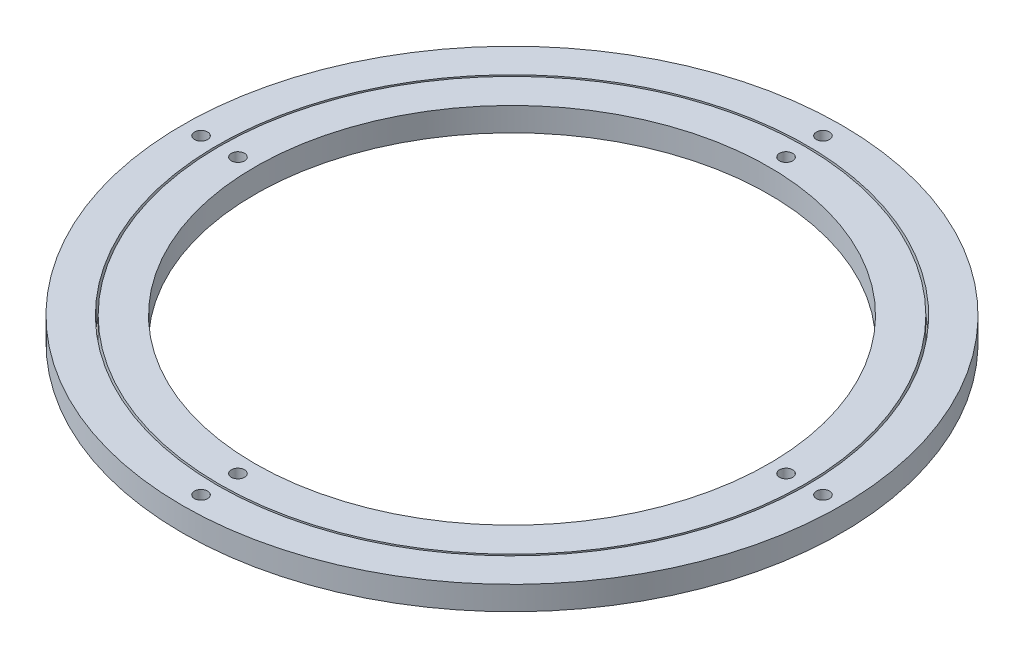
ISO-10303-21;
HEADER;
FILE_DESCRIPTION(('STEP AP214'),'2;1');
FILE_NAME('part.step','',(''),(''),'','','');
FILE_SCHEMA(('AUTOMOTIVE_DESIGN { 1 0 10303 214 1 1 1 1 }'));
ENDSEC;
DATA;
#1=APPLICATION_CONTEXT('core data for automotive mechanical design processes');
#2=APPLICATION_PROTOCOL_DEFINITION('international standard','automotive_design',2000,#1);
#3=PRODUCT_CONTEXT('',#1,'mechanical');
#4=PRODUCT('Part','Part','',(#3));
#5=PRODUCT_RELATED_PRODUCT_CATEGORY('part','',(#4));
#6=PRODUCT_DEFINITION_FORMATION('','',#4);
#7=PRODUCT_DEFINITION_CONTEXT('part definition',#1,'design');
#8=PRODUCT_DEFINITION('design','',#6,#7);
#9=PRODUCT_DEFINITION_SHAPE('','',#8);
#10=(LENGTH_UNIT() NAMED_UNIT(*) SI_UNIT(.MILLI.,.METRE.));
#11=(NAMED_UNIT(*) PLANE_ANGLE_UNIT() SI_UNIT($,.RADIAN.));
#12=(NAMED_UNIT(*) SI_UNIT($,.STERADIAN.) SOLID_ANGLE_UNIT());
#13=UNCERTAINTY_MEASURE_WITH_UNIT(LENGTH_MEASURE(1.E-05),#10,'distance_accuracy_value','');
#14=(GEOMETRIC_REPRESENTATION_CONTEXT(3) GLOBAL_UNCERTAINTY_ASSIGNED_CONTEXT((#13)) GLOBAL_UNIT_ASSIGNED_CONTEXT((#10,
#11,#12)) REPRESENTATION_CONTEXT('',''));
#15=CARTESIAN_POINT('',(0.,0.,0.));
#16=DIRECTION('',(0.,0.,1.));
#17=DIRECTION('',(1.,0.,0.));
#18=AXIS2_PLACEMENT_3D('',#15,#16,#17);
#19=CARTESIAN_POINT('',(0.,9.,0.));
#20=DIRECTION('',(0.,1.,0.));
#21=DIRECTION('',(0.,0.,1.));
#22=AXIS2_PLACEMENT_3D('',#19,#20,#21);
#23=PLANE('',#22);
#24=CARTESIAN_POINT('',(0.,9.,-103.9457));
#25=DIRECTION('',(0.,1.,0.));
#26=DIRECTION('',(0.,0.,1.));
#27=AXIS2_PLACEMENT_3D('',#24,#25,#26);
#28=CIRCLE('',#27,2.5);
#29=CARTESIAN_POINT('',(0.,9.,-101.4457));
#30=VERTEX_POINT('',#29);
#31=EDGE_CURVE('E72',#30,#30,#28,.T.);
#32=ORIENTED_EDGE('',*,*,#31,.F.);
#33=EDGE_LOOP('',(#32));
#34=FACE_BOUND('',#33,.T.);
#35=CARTESIAN_POINT('',(103.9457,9.,0.));
#36=DIRECTION('',(0.,1.,0.));
#37=DIRECTION('',(0.,0.,1.));
#38=AXIS2_PLACEMENT_3D('',#35,#36,#37);
#39=CIRCLE('',#38,2.50000000000036);
#40=CARTESIAN_POINT('',(103.9457,9.,2.50000000000034));
#41=VERTEX_POINT('',#40);
#42=EDGE_CURVE('E94',#41,#41,#39,.T.);
#43=ORIENTED_EDGE('',*,*,#42,.F.);
#44=EDGE_LOOP('',(#43));
#45=FACE_BOUND('',#44,.T.);
#46=CARTESIAN_POINT('',(0.,9.,103.9457));
#47=DIRECTION('',(0.,1.,0.));
#48=DIRECTION('',(0.,0.,1.));
#49=AXIS2_PLACEMENT_3D('',#46,#47,#48);
#50=CIRCLE('',#49,2.50000000000072);
#51=CARTESIAN_POINT('',(0.,9.,106.445700000001));
#52=VERTEX_POINT('',#51);
#53=EDGE_CURVE('E91',#52,#52,#50,.T.);
#54=ORIENTED_EDGE('',*,*,#53,.F.);
#55=EDGE_LOOP('',(#54));
#56=FACE_BOUND('',#55,.T.);
#57=CARTESIAN_POINT('',(-103.9457,9.,0.));
#58=DIRECTION('',(0.,1.,0.));
#59=DIRECTION('',(0.,0.,1.));
#60=AXIS2_PLACEMENT_3D('',#57,#58,#59);
#61=CIRCLE('',#60,2.50000000000107);
#62=CARTESIAN_POINT('',(-103.9457,9.,2.5000000000011));
#63=VERTEX_POINT('',#62);
#64=EDGE_CURVE('E88',#63,#63,#61,.T.);
#65=ORIENTED_EDGE('',*,*,#64,.F.);
#66=EDGE_LOOP('',(#65));
#67=FACE_BOUND('',#66,.T.);
#68=CARTESIAN_POINT('',(0.,9.,0.));
#69=DIRECTION('',(0.,1.,0.));
#70=DIRECTION('',(0.,0.,1.));
#71=AXIS2_PLACEMENT_3D('',#68,#69,#70);
#72=CIRCLE('',#71,111.);
#73=CARTESIAN_POINT('',(0.,9.,111.));
#74=VERTEX_POINT('',#73);
#75=EDGE_CURVE('E11',#74,#74,#72,.T.);
#76=ORIENTED_EDGE('',*,*,#75,.T.);
#77=EDGE_LOOP('',(#76));
#78=FACE_BOUND('',#77,.T.);
#79=CARTESIAN_POINT('',(0.,9.,0.));
#80=DIRECTION('',(0.,1.,0.));
#81=DIRECTION('',(0.,0.,1.));
#82=AXIS2_PLACEMENT_3D('',#79,#80,#81);
#83=CIRCLE('',#82,97.5);
#84=CARTESIAN_POINT('',(0.,9.,97.5));
#85=VERTEX_POINT('',#84);
#86=EDGE_CURVE('E62',#85,#85,#83,.T.);
#87=ORIENTED_EDGE('',*,*,#86,.F.);
#88=EDGE_LOOP('',(#87));
#89=FACE_BOUND('',#88,.T.);
#90=ADVANCED_FACE('F49',(#34,#45,#56,#67,#78,#89),#23,.T.);
#91=CARTESIAN_POINT('',(0.,0.,0.));
#92=DIRECTION('',(0.,1.,0.));
#93=DIRECTION('',(0.,0.,1.));
#94=AXIS2_PLACEMENT_3D('',#91,#92,#93);
#95=PLANE('',#94);
#96=CARTESIAN_POINT('',(0.,0.,-103.9457));
#97=DIRECTION('',(0.,1.,0.));
#98=DIRECTION('',(0.,0.,1.));
#99=AXIS2_PLACEMENT_3D('',#96,#97,#98);
#100=CIRCLE('',#99,2.5);
#101=CARTESIAN_POINT('',(0.,0.,-101.4457));
#102=VERTEX_POINT('',#101);
#103=EDGE_CURVE('E53',#102,#102,#100,.T.);
#104=ORIENTED_EDGE('',*,*,#103,.T.);
#105=EDGE_LOOP('',(#104));
#106=FACE_BOUND('',#105,.T.);
#107=CARTESIAN_POINT('',(103.9457,0.,0.));
#108=DIRECTION('',(0.,1.,0.));
#109=DIRECTION('',(0.,0.,1.));
#110=AXIS2_PLACEMENT_3D('',#107,#108,#109);
#111=CIRCLE('',#110,2.50000000000036);
#112=CARTESIAN_POINT('',(103.9457,0.,2.50000000000034));
#113=VERTEX_POINT('',#112);
#114=EDGE_CURVE('E74',#113,#113,#111,.T.);
#115=ORIENTED_EDGE('',*,*,#114,.T.);
#116=EDGE_LOOP('',(#115));
#117=FACE_BOUND('',#116,.T.);
#118=CARTESIAN_POINT('',(0.,0.,103.9457));
#119=DIRECTION('',(0.,1.,0.));
#120=DIRECTION('',(0.,0.,1.));
#121=AXIS2_PLACEMENT_3D('',#118,#119,#120);
#122=CIRCLE('',#121,2.50000000000072);
#123=CARTESIAN_POINT('',(0.,0.,106.445700000001));
#124=VERTEX_POINT('',#123);
#125=EDGE_CURVE('E71',#124,#124,#122,.T.);
#126=ORIENTED_EDGE('',*,*,#125,.T.);
#127=EDGE_LOOP('',(#126));
#128=FACE_BOUND('',#127,.T.);
#129=CARTESIAN_POINT('',(-103.9457,0.,0.));
#130=DIRECTION('',(0.,1.,0.));
#131=DIRECTION('',(0.,0.,1.));
#132=AXIS2_PLACEMENT_3D('',#129,#130,#131);
#133=CIRCLE('',#132,2.50000000000107);
#134=CARTESIAN_POINT('',(-103.9457,0.,2.5000000000011));
#135=VERTEX_POINT('',#134);
#136=EDGE_CURVE('E68',#135,#135,#133,.T.);
#137=ORIENTED_EDGE('',*,*,#136,.T.);
#138=EDGE_LOOP('',(#137));
#139=FACE_BOUND('',#138,.T.);
#140=CARTESIAN_POINT('',(0.,0.,0.));
#141=DIRECTION('',(0.,1.,0.));
#142=DIRECTION('',(0.,0.,1.));
#143=AXIS2_PLACEMENT_3D('',#140,#141,#142);
#144=CIRCLE('',#143,111.);
#145=CARTESIAN_POINT('',(0.,0.,111.));
#146=VERTEX_POINT('',#145);
#147=EDGE_CURVE('E57',#146,#146,#144,.T.);
#148=ORIENTED_EDGE('',*,*,#147,.F.);
#149=EDGE_LOOP('',(#148));
#150=FACE_BOUND('',#149,.T.);
#151=CARTESIAN_POINT('',(0.,0.,0.));
#152=DIRECTION('',(0.,1.,0.));
#153=DIRECTION('',(0.,0.,1.));
#154=AXIS2_PLACEMENT_3D('',#151,#152,#153);
#155=CIRCLE('',#154,97.5);
#156=CARTESIAN_POINT('',(0.,0.,97.5));
#157=VERTEX_POINT('',#156);
#158=EDGE_CURVE('E65',#157,#157,#155,.T.);
#159=ORIENTED_EDGE('',*,*,#158,.T.);
#160=EDGE_LOOP('',(#159));
#161=FACE_BOUND('',#160,.T.);
#162=ADVANCED_FACE('F105',(#106,#117,#128,#139,#150,#161),#95,.F.);
#163=CARTESIAN_POINT('',(0.,9.,0.));
#164=DIRECTION('',(0.,-1.,0.));
#165=DIRECTION('',(0.,0.,-1.));
#166=AXIS2_PLACEMENT_3D('',#163,#164,#165);
#167=CYLINDRICAL_SURFACE('',#166,111.);
#168=ORIENTED_EDGE('',*,*,#75,.F.);
#169=EDGE_LOOP('',(#168));
#170=FACE_BOUND('',#169,.T.);
#171=ORIENTED_EDGE('',*,*,#147,.T.);
#172=EDGE_LOOP('',(#171));
#173=FACE_BOUND('',#172,.T.);
#174=ADVANCED_FACE('F51',(#170,#173),#167,.T.);
#175=CARTESIAN_POINT('',(0.,9.,0.));
#176=DIRECTION('',(0.,-1.,0.));
#177=DIRECTION('',(0.,0.,-1.));
#178=AXIS2_PLACEMENT_3D('',#175,#176,#177);
#179=CYLINDRICAL_SURFACE('',#178,97.5);
#180=ORIENTED_EDGE('',*,*,#86,.T.);
#181=EDGE_LOOP('',(#180));
#182=FACE_BOUND('',#181,.T.);
#183=ORIENTED_EDGE('',*,*,#158,.F.);
#184=EDGE_LOOP('',(#183));
#185=FACE_BOUND('',#184,.T.);
#186=ADVANCED_FACE('F118',(#182,#185),#179,.F.);
#187=CARTESIAN_POINT('',(-103.9457,-1.,0.));
#188=DIRECTION('',(0.,1.,0.));
#189=DIRECTION('',(0.,0.,1.));
#190=AXIS2_PLACEMENT_3D('',#187,#188,#189);
#191=CYLINDRICAL_SURFACE('',#190,2.50000000000107);
#192=ORIENTED_EDGE('',*,*,#64,.T.);
#193=EDGE_LOOP('',(#192));
#194=FACE_BOUND('',#193,.T.);
#195=ORIENTED_EDGE('',*,*,#136,.F.);
#196=EDGE_LOOP('',(#195));
#197=FACE_BOUND('',#196,.T.);
#198=ADVANCED_FACE('F114',(#194,#197),#191,.F.);
#199=CARTESIAN_POINT('',(0.,-1.,103.9457));
#200=DIRECTION('',(0.,1.,0.));
#201=DIRECTION('',(0.,0.,1.));
#202=AXIS2_PLACEMENT_3D('',#199,#200,#201);
#203=CYLINDRICAL_SURFACE('',#202,2.50000000000072);
#204=ORIENTED_EDGE('',*,*,#53,.T.);
#205=EDGE_LOOP('',(#204));
#206=FACE_BOUND('',#205,.T.);
#207=ORIENTED_EDGE('',*,*,#125,.F.);
#208=EDGE_LOOP('',(#207));
#209=FACE_BOUND('',#208,.T.);
#210=ADVANCED_FACE('F117',(#206,#209),#203,.F.);
#211=CARTESIAN_POINT('',(103.9457,-1.,0.));
#212=DIRECTION('',(0.,1.,0.));
#213=DIRECTION('',(0.,0.,1.));
#214=AXIS2_PLACEMENT_3D('',#211,#212,#213);
#215=CYLINDRICAL_SURFACE('',#214,2.50000000000036);
#216=ORIENTED_EDGE('',*,*,#42,.T.);
#217=EDGE_LOOP('',(#216));
#218=FACE_BOUND('',#217,.T.);
#219=ORIENTED_EDGE('',*,*,#114,.F.);
#220=EDGE_LOOP('',(#219));
#221=FACE_BOUND('',#220,.T.);
#222=ADVANCED_FACE('F139',(#218,#221),#215,.F.);
#223=CARTESIAN_POINT('',(0.,-1.,-103.9457));
#224=DIRECTION('',(0.,1.,0.));
#225=DIRECTION('',(0.,0.,1.));
#226=AXIS2_PLACEMENT_3D('',#223,#224,#225);
#227=CYLINDRICAL_SURFACE('',#226,2.5);
#228=ORIENTED_EDGE('',*,*,#31,.T.);
#229=EDGE_LOOP('',(#228));
#230=FACE_BOUND('',#229,.T.);
#231=ORIENTED_EDGE('',*,*,#103,.F.);
#232=EDGE_LOOP('',(#231));
#233=FACE_BOUND('',#232,.T.);
#234=ADVANCED_FACE('F100',(#230,#233),#227,.F.);
#235=CLOSED_SHELL('',(#90,#162,#174,#186,#198,#210,#222,#234));
#236=MANIFOLD_SOLID_BREP('B2',#235);
#237=CARTESIAN_POINT('',(0.,9.,0.));
#238=DIRECTION('',(0.,1.,0.));
#239=DIRECTION('',(0.,0.,1.));
#240=AXIS2_PLACEMENT_3D('',#237,#238,#239);
#241=PLANE('',#240);
#242=CARTESIAN_POINT('',(0.,9.,-117.9457));
#243=DIRECTION('',(0.,1.,0.));
#244=DIRECTION('',(0.,0.,1.));
#245=AXIS2_PLACEMENT_3D('',#242,#243,#244);
#246=CIRCLE('',#245,2.5);
#247=CARTESIAN_POINT('',(0.,9.,-115.4457));
#248=VERTEX_POINT('',#247);
#249=EDGE_CURVE('E223',#248,#248,#246,.T.);
#250=ORIENTED_EDGE('',*,*,#249,.F.);
#251=EDGE_LOOP('',(#250));
#252=FACE_BOUND('',#251,.T.);
#253=CARTESIAN_POINT('',(117.945700000003,9.,-3.33777423156778E-12));
#254=DIRECTION('',(0.,1.,0.));
#255=DIRECTION('',(0.,0.,1.));
#256=AXIS2_PLACEMENT_3D('',#253,#254,#255);
#257=CIRCLE('',#256,2.50000000000261);
#258=CARTESIAN_POINT('',(117.945700000003,9.,2.49999999999927));
#259=VERTEX_POINT('',#258);
#260=EDGE_CURVE('E252',#259,#259,#257,.T.);
#261=ORIENTED_EDGE('',*,*,#260,.F.);
#262=EDGE_LOOP('',(#261));
#263=FACE_BOUND('',#262,.T.);
#264=CARTESIAN_POINT('',(6.67554846313556E-12,9.,117.9457));
#265=DIRECTION('',(0.,1.,0.));
#266=DIRECTION('',(0.,0.,1.));
#267=AXIS2_PLACEMENT_3D('',#264,#265,#266);
#268=CIRCLE('',#267,2.50000000000717);
#269=CARTESIAN_POINT('',(6.67554846313556E-12,9.,120.445700000007));
#270=VERTEX_POINT('',#269);
#271=EDGE_CURVE('E248',#270,#270,#268,.T.);
#272=ORIENTED_EDGE('',*,*,#271,.F.);
#273=EDGE_LOOP('',(#272));
#274=FACE_BOUND('',#273,.T.);
#275=CARTESIAN_POINT('',(-117.945699999997,9.,3.3522184139656E-12));
#276=DIRECTION('',(0.,1.,0.));
#277=DIRECTION('',(0.,0.,1.));
#278=AXIS2_PLACEMENT_3D('',#275,#276,#277);
#279=CIRCLE('',#278,2.50000000000536);
#280=CARTESIAN_POINT('',(-117.945699999997,9.,2.50000000000871));
#281=VERTEX_POINT('',#280);
#282=EDGE_CURVE('E244',#281,#281,#279,.T.);
#283=ORIENTED_EDGE('',*,*,#282,.F.);
#284=EDGE_LOOP('',(#283));
#285=FACE_BOUND('',#284,.T.);
#286=CARTESIAN_POINT('',(0.,9.,0.));
#287=DIRECTION('',(0.,1.,0.));
#288=DIRECTION('',(0.,0.,1.));
#289=AXIS2_PLACEMENT_3D('',#286,#287,#288);
#290=CIRCLE('',#289,125.);
#291=CARTESIAN_POINT('',(0.,9.,125.));
#292=VERTEX_POINT('',#291);
#293=EDGE_CURVE('E48',#292,#292,#290,.T.);
#294=ORIENTED_EDGE('',*,*,#293,.T.);
#295=EDGE_LOOP('',(#294));
#296=FACE_BOUND('',#295,.T.);
#297=CARTESIAN_POINT('',(0.,9.,0.));
#298=DIRECTION('',(0.,1.,0.));
#299=DIRECTION('',(0.,0.,1.));
#300=AXIS2_PLACEMENT_3D('',#297,#298,#299);
#301=CIRCLE('',#300,111.75);
#302=CARTESIAN_POINT('',(0.,9.,111.75));
#303=VERTEX_POINT('',#302);
#304=EDGE_CURVE('E212',#303,#303,#301,.T.);
#305=ORIENTED_EDGE('',*,*,#304,.F.);
#306=EDGE_LOOP('',(#305));
#307=FACE_BOUND('',#306,.T.);
#308=ADVANCED_FACE('F197',(#252,#263,#274,#285,#296,#307),#241,.T.);
#309=CARTESIAN_POINT('',(0.,0.,0.));
#310=DIRECTION('',(0.,1.,0.));
#311=DIRECTION('',(0.,0.,1.));
#312=AXIS2_PLACEMENT_3D('',#309,#310,#311);
#313=PLANE('',#312);
#314=CARTESIAN_POINT('',(0.,0.,-117.9457));
#315=DIRECTION('',(0.,1.,0.));
#316=DIRECTION('',(0.,0.,1.));
#317=AXIS2_PLACEMENT_3D('',#314,#315,#316);
#318=CIRCLE('',#317,2.5);
#319=CARTESIAN_POINT('',(0.,0.,-115.4457));
#320=VERTEX_POINT('',#319);
#321=EDGE_CURVE('E201',#320,#320,#318,.T.);
#322=ORIENTED_EDGE('',*,*,#321,.T.);
#323=EDGE_LOOP('',(#322));
#324=FACE_BOUND('',#323,.T.);
#325=CARTESIAN_POINT('',(117.945700000003,0.,-3.33777423156778E-12));
#326=DIRECTION('',(0.,1.,0.));
#327=DIRECTION('',(0.,0.,1.));
#328=AXIS2_PLACEMENT_3D('',#325,#326,#327);
#329=CIRCLE('',#328,2.50000000000261);
#330=CARTESIAN_POINT('',(117.945700000003,0.,2.49999999999927));
#331=VERTEX_POINT('',#330);
#332=EDGE_CURVE('E226',#331,#331,#329,.T.);
#333=ORIENTED_EDGE('',*,*,#332,.T.);
#334=EDGE_LOOP('',(#333));
#335=FACE_BOUND('',#334,.T.);
#336=CARTESIAN_POINT('',(6.67554846313556E-12,0.,117.9457));
#337=DIRECTION('',(0.,1.,0.));
#338=DIRECTION('',(0.,0.,1.));
#339=AXIS2_PLACEMENT_3D('',#336,#337,#338);
#340=CIRCLE('',#339,2.50000000000717);
#341=CARTESIAN_POINT('',(6.67554846313556E-12,0.,120.445700000007));
#342=VERTEX_POINT('',#341);
#343=EDGE_CURVE('E222',#342,#342,#340,.T.);
#344=ORIENTED_EDGE('',*,*,#343,.T.);
#345=EDGE_LOOP('',(#344));
#346=FACE_BOUND('',#345,.T.);
#347=CARTESIAN_POINT('',(-117.945699999997,0.,3.3522184139656E-12));
#348=DIRECTION('',(0.,1.,0.));
#349=DIRECTION('',(0.,0.,1.));
#350=AXIS2_PLACEMENT_3D('',#347,#348,#349);
#351=CIRCLE('',#350,2.50000000000536);
#352=CARTESIAN_POINT('',(-117.945699999997,0.,2.50000000000871));
#353=VERTEX_POINT('',#352);
#354=EDGE_CURVE('E218',#353,#353,#351,.T.);
#355=ORIENTED_EDGE('',*,*,#354,.T.);
#356=EDGE_LOOP('',(#355));
#357=FACE_BOUND('',#356,.T.);
#358=CARTESIAN_POINT('',(0.,0.,0.));
#359=DIRECTION('',(0.,1.,0.));
#360=DIRECTION('',(0.,0.,1.));
#361=AXIS2_PLACEMENT_3D('',#358,#359,#360);
#362=CIRCLE('',#361,125.);
#363=CARTESIAN_POINT('',(0.,0.,125.));
#364=VERTEX_POINT('',#363);
#365=EDGE_CURVE('E206',#364,#364,#362,.T.);
#366=ORIENTED_EDGE('',*,*,#365,.F.);
#367=EDGE_LOOP('',(#366));
#368=FACE_BOUND('',#367,.T.);
#369=CARTESIAN_POINT('',(0.,0.,0.));
#370=DIRECTION('',(0.,1.,0.));
#371=DIRECTION('',(0.,0.,1.));
#372=AXIS2_PLACEMENT_3D('',#369,#370,#371);
#373=CIRCLE('',#372,111.75);
#374=CARTESIAN_POINT('',(0.,0.,111.75));
#375=VERTEX_POINT('',#374);
#376=EDGE_CURVE('E215',#375,#375,#373,.T.);
#377=ORIENTED_EDGE('',*,*,#376,.T.);
#378=EDGE_LOOP('',(#377));
#379=FACE_BOUND('',#378,.T.);
#380=ADVANCED_FACE('F265',(#324,#335,#346,#357,#368,#379),#313,.F.);
#381=CARTESIAN_POINT('',(0.,9.,0.));
#382=DIRECTION('',(0.,-1.,0.));
#383=DIRECTION('',(0.,0.,-1.));
#384=AXIS2_PLACEMENT_3D('',#381,#382,#383);
#385=CYLINDRICAL_SURFACE('',#384,125.);
#386=ORIENTED_EDGE('',*,*,#293,.F.);
#387=EDGE_LOOP('',(#386));
#388=FACE_BOUND('',#387,.T.);
#389=ORIENTED_EDGE('',*,*,#365,.T.);
#390=EDGE_LOOP('',(#389));
#391=FACE_BOUND('',#390,.T.);
#392=ADVANCED_FACE('F199',(#388,#391),#385,.T.);
#393=CARTESIAN_POINT('',(0.,9.,0.));
#394=DIRECTION('',(0.,-1.,0.));
#395=DIRECTION('',(0.,0.,-1.));
#396=AXIS2_PLACEMENT_3D('',#393,#394,#395);
#397=CYLINDRICAL_SURFACE('',#396,111.75);
#398=ORIENTED_EDGE('',*,*,#304,.T.);
#399=EDGE_LOOP('',(#398));
#400=FACE_BOUND('',#399,.T.);
#401=ORIENTED_EDGE('',*,*,#376,.F.);
#402=EDGE_LOOP('',(#401));
#403=FACE_BOUND('',#402,.T.);
#404=ADVANCED_FACE('F278',(#400,#403),#397,.F.);
#405=CARTESIAN_POINT('',(-117.945699999997,-1.,3.3522184139656E-12));
#406=DIRECTION('',(0.,1.,0.));
#407=DIRECTION('',(0.,0.,1.));
#408=AXIS2_PLACEMENT_3D('',#405,#406,#407);
#409=CYLINDRICAL_SURFACE('',#408,2.50000000000536);
#410=ORIENTED_EDGE('',*,*,#282,.T.);
#411=EDGE_LOOP('',(#410));
#412=FACE_BOUND('',#411,.T.);
#413=ORIENTED_EDGE('',*,*,#354,.F.);
#414=EDGE_LOOP('',(#413));
#415=FACE_BOUND('',#414,.T.);
#416=ADVANCED_FACE('F274',(#412,#415),#409,.F.);
#417=CARTESIAN_POINT('',(6.67554846313556E-12,-1.,117.9457));
#418=DIRECTION('',(0.,1.,0.));
#419=DIRECTION('',(0.,0.,1.));
#420=AXIS2_PLACEMENT_3D('',#417,#418,#419);
#421=CYLINDRICAL_SURFACE('',#420,2.50000000000717);
#422=ORIENTED_EDGE('',*,*,#271,.T.);
#423=EDGE_LOOP('',(#422));
#424=FACE_BOUND('',#423,.T.);
#425=ORIENTED_EDGE('',*,*,#343,.F.);
#426=EDGE_LOOP('',(#425));
#427=FACE_BOUND('',#426,.T.);
#428=ADVANCED_FACE('F277',(#424,#427),#421,.F.);
#429=CARTESIAN_POINT('',(117.945700000003,-1.,-3.33777423156778E-12));
#430=DIRECTION('',(0.,1.,0.));
#431=DIRECTION('',(0.,0.,1.));
#432=AXIS2_PLACEMENT_3D('',#429,#430,#431);
#433=CYLINDRICAL_SURFACE('',#432,2.50000000000261);
#434=ORIENTED_EDGE('',*,*,#260,.T.);
#435=EDGE_LOOP('',(#434));
#436=FACE_BOUND('',#435,.T.);
#437=ORIENTED_EDGE('',*,*,#332,.F.);
#438=EDGE_LOOP('',(#437));
#439=FACE_BOUND('',#438,.T.);
#440=ADVANCED_FACE('F299',(#436,#439),#433,.F.);
#441=CARTESIAN_POINT('',(0.,-1.,-117.9457));
#442=DIRECTION('',(0.,1.,0.));
#443=DIRECTION('',(0.,0.,1.));
#444=AXIS2_PLACEMENT_3D('',#441,#442,#443);
#445=CYLINDRICAL_SURFACE('',#444,2.5);
#446=ORIENTED_EDGE('',*,*,#249,.T.);
#447=EDGE_LOOP('',(#446));
#448=FACE_BOUND('',#447,.T.);
#449=ORIENTED_EDGE('',*,*,#321,.F.);
#450=EDGE_LOOP('',(#449));
#451=FACE_BOUND('',#450,.T.);
#452=ADVANCED_FACE('F260',(#448,#451),#445,.F.);
#453=CLOSED_SHELL('',(#308,#380,#392,#404,#416,#428,#440,#452));
#454=MANIFOLD_SOLID_BREP('B6',#453);
#455=ADVANCED_BREP_SHAPE_REPRESENTATION('',(#18,#236,#454),#14);
#456=SHAPE_DEFINITION_REPRESENTATION(#9,#455);
ENDSEC;
END-ISO-10303-21;
